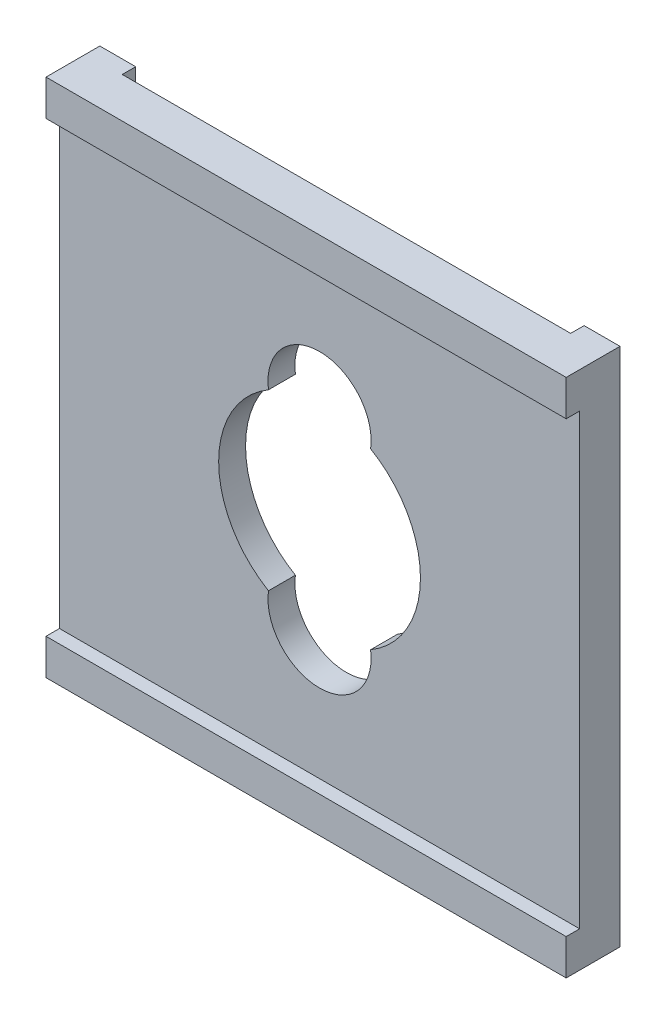
ISO-10303-21;
HEADER;
FILE_DESCRIPTION(('STEP AP214'),'2;1');
FILE_NAME('part.step','',(''),(''),'','','');
FILE_SCHEMA(('AUTOMOTIVE_DESIGN { 1 0 10303 214 1 1 1 1 }'));
ENDSEC;
DATA;
#1=APPLICATION_CONTEXT('core data for automotive mechanical design processes');
#2=APPLICATION_PROTOCOL_DEFINITION('international standard','automotive_design',2000,#1);
#3=PRODUCT_CONTEXT('',#1,'mechanical');
#4=PRODUCT('Part','Part','',(#3));
#5=PRODUCT_RELATED_PRODUCT_CATEGORY('part','',(#4));
#6=PRODUCT_DEFINITION_FORMATION('','',#4);
#7=PRODUCT_DEFINITION_CONTEXT('part definition',#1,'design');
#8=PRODUCT_DEFINITION('design','',#6,#7);
#9=PRODUCT_DEFINITION_SHAPE('','',#8);
#10=(LENGTH_UNIT() NAMED_UNIT(*) SI_UNIT(.MILLI.,.METRE.));
#11=(NAMED_UNIT(*) PLANE_ANGLE_UNIT() SI_UNIT($,.RADIAN.));
#12=(NAMED_UNIT(*) SI_UNIT($,.STERADIAN.) SOLID_ANGLE_UNIT());
#13=UNCERTAINTY_MEASURE_WITH_UNIT(LENGTH_MEASURE(1.E-05),#10,'distance_accuracy_value','');
#14=(GEOMETRIC_REPRESENTATION_CONTEXT(3) GLOBAL_UNCERTAINTY_ASSIGNED_CONTEXT((#13)) GLOBAL_UNIT_ASSIGNED_CONTEXT((#10,
#11,#12)) REPRESENTATION_CONTEXT('',''));
#15=CARTESIAN_POINT('',(0.,0.,0.));
#16=DIRECTION('',(0.,0.,1.));
#17=DIRECTION('',(1.,0.,0.));
#18=AXIS2_PLACEMENT_3D('',#15,#16,#17);
#19=CARTESIAN_POINT('',(-0.0195470704777411,0.0021960930231779,10.8922710575984));
#20=DIRECTION('',(0.,0.,-1.));
#21=DIRECTION('',(0.,-1.,0.));
#22=AXIS2_PLACEMENT_3D('',#19,#20,#21);
#23=PLANE('',#22);
#24=DIRECTION('',(0.,-1.,0.));
#25=VECTOR('',#24,1.);
#26=CARTESIAN_POINT('',(28.9804529295222,25.0021960930232,10.8922710575984));
#27=LINE('',#26,#25);
#28=CARTESIAN_POINT('',(28.9804529295222,25.0021960930232,10.8922710575984));
#29=VERTEX_POINT('',#28);
#30=CARTESIAN_POINT('',(28.9804529295222,-24.9978039069768,10.8922710575984));
#31=VERTEX_POINT('',#30);
#32=EDGE_CURVE('E35',#29,#31,#27,.T.);
#33=ORIENTED_EDGE('',*,*,#32,.F.);
#34=DIRECTION('',(-1.,0.,0.));
#35=VECTOR('',#34,1.);
#36=CARTESIAN_POINT('',(28.9804529295222,25.0021960930232,10.8922710575984));
#37=LINE('',#36,#35);
#38=CARTESIAN_POINT('',(-29.0195470704777,25.0021960930232,10.8922710575984));
#39=VERTEX_POINT('',#38);
#40=EDGE_CURVE('E11',#29,#39,#37,.T.);
#41=ORIENTED_EDGE('',*,*,#40,.T.);
#42=DIRECTION('',(0.,1.,0.));
#43=VECTOR('',#42,1.);
#44=CARTESIAN_POINT('',(-29.0195470704778,-24.9978039069768,10.8922710575984));
#45=LINE('',#44,#43);
#46=CARTESIAN_POINT('',(-29.0195470704778,-24.9978039069768,10.8922710575984));
#47=VERTEX_POINT('',#46);
#48=EDGE_CURVE('E149',#47,#39,#45,.T.);
#49=ORIENTED_EDGE('',*,*,#48,.F.);
#50=DIRECTION('',(-1.,0.,0.));
#51=VECTOR('',#50,1.);
#52=CARTESIAN_POINT('',(28.9804529295222,-24.9978039069768,10.8922710575984));
#53=LINE('',#52,#51);
#54=EDGE_CURVE('E173',#31,#47,#53,.T.);
#55=ORIENTED_EDGE('',*,*,#54,.F.);
#56=EDGE_LOOP('',(#33,#41,#49,#55));
#57=FACE_BOUND('',#56,.T.);
#58=CARTESIAN_POINT('',(-0.0195470704777371,10.5021960930232,10.8922710575984));
#59=DIRECTION('',(0.,0.,1.));
#60=DIRECTION('',(0.990332152637792,-0.138716356107699,0.));
#61=AXIS2_PLACEMENT_3D('',#58,#59,#60);
#62=CIRCLE('',#61,5.75);
#63=CARTESIAN_POINT('',(5.67486280718927,9.70457704540417,10.8922710575984));
#64=VERTEX_POINT('',#63);
#65=CARTESIAN_POINT('',(-5.71395694814473,9.70457704540418,10.8922710575984));
#66=VERTEX_POINT('',#65);
#67=EDGE_CURVE('E240',#64,#66,#62,.T.);
#68=ORIENTED_EDGE('',*,*,#67,.F.);
#69=CARTESIAN_POINT('',(-0.0195470704777411,0.0021960930231779,10.8922710575984));
#70=DIRECTION('',(0.,0.,1.));
#71=DIRECTION('',(0.506169766903774,-0.862433862433856,0.));
#72=AXIS2_PLACEMENT_3D('',#69,#70,#71);
#73=CIRCLE('',#72,11.25);
#74=CARTESIAN_POINT('',(5.67486280718926,-9.70018485935782,10.8922710575984));
#75=VERTEX_POINT('',#74);
#76=EDGE_CURVE('E234',#75,#64,#73,.T.);
#77=ORIENTED_EDGE('',*,*,#76,.F.);
#78=CARTESIAN_POINT('',(-0.0195470704777451,-10.4978039069768,10.8922710575984));
#79=DIRECTION('',(0.,0.,1.));
#80=DIRECTION('',(-0.990332152637792,0.138716356107699,0.));
#81=AXIS2_PLACEMENT_3D('',#78,#79,#80);
#82=CIRCLE('',#81,5.75);
#83=CARTESIAN_POINT('',(-5.71395694814475,-9.70018485935781,10.8922710575984));
#84=VERTEX_POINT('',#83);
#85=EDGE_CURVE('E216',#84,#75,#82,.T.);
#86=ORIENTED_EDGE('',*,*,#85,.F.);
#87=CARTESIAN_POINT('',(-0.0195470704777411,0.0021960930231779,10.8922710575984));
#88=DIRECTION('',(0.,0.,1.));
#89=DIRECTION('',(-0.506169766903774,0.862433862433856,0.));
#90=AXIS2_PLACEMENT_3D('',#87,#88,#89);
#91=CIRCLE('',#90,11.25);
#92=EDGE_CURVE('E243',#66,#84,#91,.T.);
#93=ORIENTED_EDGE('',*,*,#92,.F.);
#94=EDGE_LOOP('',(#68,#77,#86,#93));
#95=FACE_BOUND('',#94,.T.);
#96=ADVANCED_FACE('F17',(#57,#95),#23,.F.);
#97=CARTESIAN_POINT('',(-0.0195470704777411,0.0021960930231779,10.8922710575984));
#98=DIRECTION('',(0.,0.,-1.));
#99=DIRECTION('',(0.,-1.,0.));
#100=AXIS2_PLACEMENT_3D('',#97,#98,#99);
#101=CYLINDRICAL_SURFACE('',#100,11.25);
#102=DIRECTION('',(0.,0.,-1.));
#103=VECTOR('',#102,1.);
#104=CARTESIAN_POINT('',(-5.71395694814475,-9.70018485935781,10.8922710575984));
#105=LINE('',#104,#103);
#106=CARTESIAN_POINT('',(-5.71395694814475,-9.70018485935781,7.89227105759841));
#107=VERTEX_POINT('',#106);
#108=EDGE_CURVE('E27',#84,#107,#105,.T.);
#109=ORIENTED_EDGE('',*,*,#108,.T.);
#110=CARTESIAN_POINT('',(-0.0195470704777411,0.0021960930231779,7.89227105759841));
#111=DIRECTION('',(0.,0.,1.));
#112=DIRECTION('',(-0.506169766903774,0.862433862433856,0.));
#113=AXIS2_PLACEMENT_3D('',#110,#111,#112);
#114=CIRCLE('',#113,11.25);
#115=CARTESIAN_POINT('',(-5.71395694814473,9.70457704540418,7.89227105759841));
#116=VERTEX_POINT('',#115);
#117=EDGE_CURVE('E208',#116,#107,#114,.T.);
#118=ORIENTED_EDGE('',*,*,#117,.F.);
#119=DIRECTION('',(0.,0.,-1.));
#120=VECTOR('',#119,1.);
#121=CARTESIAN_POINT('',(-5.71395694814473,9.70457704540418,10.8922710575984));
#122=LINE('',#121,#120);
#123=EDGE_CURVE('E245',#66,#116,#122,.T.);
#124=ORIENTED_EDGE('',*,*,#123,.F.);
#125=ORIENTED_EDGE('',*,*,#92,.T.);
#126=EDGE_LOOP('',(#109,#118,#124,#125));
#127=FACE_BOUND('',#126,.T.);
#128=ADVANCED_FACE('F303',(#127),#101,.F.);
#129=CARTESIAN_POINT('',(-0.0195470704777371,10.5021960930232,10.8922710575984));
#130=DIRECTION('',(0.,0.,-1.));
#131=DIRECTION('',(0.,-1.,0.));
#132=AXIS2_PLACEMENT_3D('',#129,#130,#131);
#133=CYLINDRICAL_SURFACE('',#132,5.75);
#134=ORIENTED_EDGE('',*,*,#123,.T.);
#135=CARTESIAN_POINT('',(-0.0195470704777371,10.5021960930232,7.89227105759841));
#136=DIRECTION('',(0.,0.,1.));
#137=DIRECTION('',(0.990332152637792,-0.138716356107699,0.));
#138=AXIS2_PLACEMENT_3D('',#135,#136,#137);
#139=CIRCLE('',#138,5.75);
#140=CARTESIAN_POINT('',(5.67486280718927,9.70457704540417,7.89227105759841));
#141=VERTEX_POINT('',#140);
#142=EDGE_CURVE('E230',#141,#116,#139,.T.);
#143=ORIENTED_EDGE('',*,*,#142,.F.);
#144=DIRECTION('',(0.,0.,-1.));
#145=VECTOR('',#144,1.);
#146=CARTESIAN_POINT('',(5.67486280718927,9.70457704540417,10.8922710575984));
#147=LINE('',#146,#145);
#148=EDGE_CURVE('E237',#64,#141,#147,.T.);
#149=ORIENTED_EDGE('',*,*,#148,.F.);
#150=ORIENTED_EDGE('',*,*,#67,.T.);
#151=EDGE_LOOP('',(#134,#143,#149,#150));
#152=FACE_BOUND('',#151,.T.);
#153=ADVANCED_FACE('F308',(#152),#133,.F.);
#154=CARTESIAN_POINT('',(-0.0195470704777411,0.0021960930231779,10.8922710575984));
#155=DIRECTION('',(0.,0.,-1.));
#156=DIRECTION('',(0.,-1.,0.));
#157=AXIS2_PLACEMENT_3D('',#154,#155,#156);
#158=CYLINDRICAL_SURFACE('',#157,11.25);
#159=ORIENTED_EDGE('',*,*,#148,.T.);
#160=CARTESIAN_POINT('',(-0.0195470704777411,0.0021960930231779,7.89227105759841));
#161=DIRECTION('',(0.,0.,1.));
#162=DIRECTION('',(0.506169766903774,-0.862433862433856,0.));
#163=AXIS2_PLACEMENT_3D('',#160,#161,#162);
#164=CIRCLE('',#163,11.25);
#165=CARTESIAN_POINT('',(5.67486280718926,-9.70018485935782,7.89227105759841));
#166=VERTEX_POINT('',#165);
#167=EDGE_CURVE('E227',#166,#141,#164,.T.);
#168=ORIENTED_EDGE('',*,*,#167,.F.);
#169=DIRECTION('',(0.,0.,-1.));
#170=VECTOR('',#169,1.);
#171=CARTESIAN_POINT('',(5.67486280718926,-9.70018485935782,10.8922710575984));
#172=LINE('',#171,#170);
#173=EDGE_CURVE('E231',#75,#166,#172,.T.);
#174=ORIENTED_EDGE('',*,*,#173,.F.);
#175=ORIENTED_EDGE('',*,*,#76,.T.);
#176=EDGE_LOOP('',(#159,#168,#174,#175));
#177=FACE_BOUND('',#176,.T.);
#178=ADVANCED_FACE('F314',(#177),#158,.F.);
#179=CARTESIAN_POINT('',(-0.0195470704777451,-10.4978039069768,10.8922710575984));
#180=DIRECTION('',(0.,0.,-1.));
#181=DIRECTION('',(0.,-1.,0.));
#182=AXIS2_PLACEMENT_3D('',#179,#180,#181);
#183=CYLINDRICAL_SURFACE('',#182,5.75);
#184=ORIENTED_EDGE('',*,*,#173,.T.);
#185=CARTESIAN_POINT('',(-0.0195470704777451,-10.4978039069768,7.89227105759841));
#186=DIRECTION('',(0.,0.,1.));
#187=DIRECTION('',(-0.990332152637792,0.138716356107699,0.));
#188=AXIS2_PLACEMENT_3D('',#185,#186,#187);
#189=CIRCLE('',#188,5.75);
#190=EDGE_CURVE('E223',#107,#166,#189,.T.);
#191=ORIENTED_EDGE('',*,*,#190,.F.);
#192=ORIENTED_EDGE('',*,*,#108,.F.);
#193=ORIENTED_EDGE('',*,*,#85,.T.);
#194=EDGE_LOOP('',(#184,#191,#192,#193));
#195=FACE_BOUND('',#194,.T.);
#196=ADVANCED_FACE('F318',(#195),#183,.F.);
#197=CARTESIAN_POINT('',(-0.0195470704777411,0.0021960930231779,7.89227105759841));
#198=DIRECTION('',(0.,0.,-1.));
#199=DIRECTION('',(0.,-1.,0.));
#200=AXIS2_PLACEMENT_3D('',#197,#198,#199);
#201=PLANE('',#200);
#202=DIRECTION('',(1.,0.,0.));
#203=VECTOR('',#202,1.);
#204=CARTESIAN_POINT('',(-25.0195470704777,29.0021960930232,7.89227105759841));
#205=LINE('',#204,#203);
#206=CARTESIAN_POINT('',(-25.0195470704777,29.0021960930232,7.89227105759841));
#207=VERTEX_POINT('',#206);
#208=CARTESIAN_POINT('',(24.9804529295222,29.0021960930232,7.89227105759841));
#209=VERTEX_POINT('',#208);
#210=EDGE_CURVE('E213',#207,#209,#205,.T.);
#211=ORIENTED_EDGE('',*,*,#210,.T.);
#212=DIRECTION('',(0.,-1.,0.));
#213=VECTOR('',#212,1.);
#214=CARTESIAN_POINT('',(24.9804529295222,29.0021960930232,7.89227105759841));
#215=LINE('',#214,#213);
#216=CARTESIAN_POINT('',(24.9804529295222,-28.9978039069768,7.89227105759841));
#217=VERTEX_POINT('',#216);
#218=EDGE_CURVE('E217',#209,#217,#215,.T.);
#219=ORIENTED_EDGE('',*,*,#218,.T.);
#220=DIRECTION('',(-1.,0.,0.));
#221=VECTOR('',#220,1.);
#222=CARTESIAN_POINT('',(24.9804529295222,-28.9978039069768,7.89227105759841));
#223=LINE('',#222,#221);
#224=CARTESIAN_POINT('',(-25.0195470704777,-28.9978039069767,7.89227105759841));
#225=VERTEX_POINT('',#224);
#226=EDGE_CURVE('E220',#217,#225,#223,.T.);
#227=ORIENTED_EDGE('',*,*,#226,.T.);
#228=DIRECTION('',(0.,-1.,0.));
#229=VECTOR('',#228,1.);
#230=CARTESIAN_POINT('',(-25.0195470704777,29.0021960930232,7.89227105759841));
#231=LINE('',#230,#229);
#232=EDGE_CURVE('E209',#207,#225,#231,.T.);
#233=ORIENTED_EDGE('',*,*,#232,.F.);
#234=EDGE_LOOP('',(#211,#219,#227,#233));
#235=FACE_BOUND('',#234,.T.);
#236=ORIENTED_EDGE('',*,*,#190,.T.);
#237=ORIENTED_EDGE('',*,*,#167,.T.);
#238=ORIENTED_EDGE('',*,*,#142,.T.);
#239=ORIENTED_EDGE('',*,*,#117,.T.);
#240=EDGE_LOOP('',(#236,#237,#238,#239));
#241=FACE_BOUND('',#240,.T.);
#242=ADVANCED_FACE('F286',(#235,#241),#201,.T.);
#243=CARTESIAN_POINT('',(-25.0195470704777,29.0021960930232,7.89227105759841));
#244=DIRECTION('',(1.,0.,0.));
#245=DIRECTION('',(0.,-1.,0.));
#246=AXIS2_PLACEMENT_3D('',#243,#244,#245);
#247=PLANE('',#246);
#248=DIRECTION('',(0.,0.,-1.));
#249=VECTOR('',#248,1.);
#250=CARTESIAN_POINT('',(-25.0195470704777,-28.9978039069767,7.89227105759841));
#251=LINE('',#250,#249);
#252=CARTESIAN_POINT('',(-25.0195470704777,-28.9978039069767,6.3922710575984));
#253=VERTEX_POINT('',#252);
#254=EDGE_CURVE('E207',#225,#253,#251,.T.);
#255=ORIENTED_EDGE('',*,*,#254,.T.);
#256=DIRECTION('',(0.,-1.,0.));
#257=VECTOR('',#256,1.);
#258=CARTESIAN_POINT('',(-25.0195470704777,29.0021960930232,6.3922710575984));
#259=LINE('',#258,#257);
#260=CARTESIAN_POINT('',(-25.0195470704777,29.0021960930232,6.3922710575984));
#261=VERTEX_POINT('',#260);
#262=EDGE_CURVE('E152',#261,#253,#259,.T.);
#263=ORIENTED_EDGE('',*,*,#262,.F.);
#264=DIRECTION('',(0.,0.,-1.));
#265=VECTOR('',#264,1.);
#266=CARTESIAN_POINT('',(-25.0195470704777,29.0021960930232,7.89227105759841));
#267=LINE('',#266,#265);
#268=EDGE_CURVE('E187',#207,#261,#267,.T.);
#269=ORIENTED_EDGE('',*,*,#268,.F.);
#270=ORIENTED_EDGE('',*,*,#232,.T.);
#271=EDGE_LOOP('',(#255,#263,#269,#270));
#272=FACE_BOUND('',#271,.T.);
#273=ADVANCED_FACE('F281',(#272),#247,.T.);
#274=CARTESIAN_POINT('',(-29.0195470704777,29.0021960930232,10.8922710575984));
#275=DIRECTION('',(0.,1.,0.));
#276=DIRECTION('',(1.,0.,0.));
#277=AXIS2_PLACEMENT_3D('',#274,#275,#276);
#278=PLANE('',#277);
#279=DIRECTION('',(1.,0.,0.));
#280=VECTOR('',#279,1.);
#281=CARTESIAN_POINT('',(24.9804529295222,29.0021960930232,6.3922710575984));
#282=LINE('',#281,#280);
#283=CARTESIAN_POINT('',(24.9804529295222,29.0021960930232,6.3922710575984));
#284=VERTEX_POINT('',#283);
#285=CARTESIAN_POINT('',(28.9804529295222,29.0021960930232,6.3922710575984));
#286=VERTEX_POINT('',#285);
#287=EDGE_CURVE('E195',#284,#286,#282,.T.);
#288=ORIENTED_EDGE('',*,*,#287,.F.);
#289=DIRECTION('',(0.,0.,-1.));
#290=VECTOR('',#289,1.);
#291=CARTESIAN_POINT('',(24.9804529295222,29.0021960930232,7.89227105759841));
#292=LINE('',#291,#290);
#293=EDGE_CURVE('E172',#209,#284,#292,.T.);
#294=ORIENTED_EDGE('',*,*,#293,.F.);
#295=ORIENTED_EDGE('',*,*,#210,.F.);
#296=ORIENTED_EDGE('',*,*,#268,.T.);
#297=DIRECTION('',(1.,0.,0.));
#298=VECTOR('',#297,1.);
#299=CARTESIAN_POINT('',(-29.0195470704777,29.0021960930232,6.3922710575984));
#300=LINE('',#299,#298);
#301=CARTESIAN_POINT('',(-29.0195470704777,29.0021960930232,6.3922710575984));
#302=VERTEX_POINT('',#301);
#303=EDGE_CURVE('E154',#302,#261,#300,.T.);
#304=ORIENTED_EDGE('',*,*,#303,.F.);
#305=DIRECTION('',(0.,0.,-1.));
#306=VECTOR('',#305,1.);
#307=CARTESIAN_POINT('',(-29.0195470704777,29.0021960930232,12.3922710575984));
#308=LINE('',#307,#306);
#309=CARTESIAN_POINT('',(-29.0195470704777,29.0021960930232,12.3922710575984));
#310=VERTEX_POINT('',#309);
#311=EDGE_CURVE('E134',#310,#302,#308,.T.);
#312=ORIENTED_EDGE('',*,*,#311,.F.);
#313=DIRECTION('',(-1.,0.,0.));
#314=VECTOR('',#313,1.);
#315=CARTESIAN_POINT('',(28.9804529295222,29.0021960930232,12.3922710575984));
#316=LINE('',#315,#314);
#317=CARTESIAN_POINT('',(28.9804529295222,29.0021960930232,12.3922710575984));
#318=VERTEX_POINT('',#317);
#319=EDGE_CURVE('E176',#318,#310,#316,.T.);
#320=ORIENTED_EDGE('',*,*,#319,.F.);
#321=DIRECTION('',(0.,0.,1.));
#322=VECTOR('',#321,1.);
#323=CARTESIAN_POINT('',(28.9804529295222,29.0021960930232,6.3922710575984));
#324=LINE('',#323,#322);
#325=EDGE_CURVE('E192',#286,#318,#324,.T.);
#326=ORIENTED_EDGE('',*,*,#325,.F.);
#327=EDGE_LOOP('',(#288,#294,#295,#296,#304,#312,#320,#326));
#328=FACE_BOUND('',#327,.T.);
#329=ADVANCED_FACE('F276',(#328),#278,.T.);
#330=CARTESIAN_POINT('',(28.9804529295222,29.0021960930232,10.8922710575984));
#331=DIRECTION('',(1.,0.,0.));
#332=DIRECTION('',(0.,-1.,0.));
#333=AXIS2_PLACEMENT_3D('',#330,#331,#332);
#334=PLANE('',#333);
#335=DIRECTION('',(0.,0.,1.));
#336=VECTOR('',#335,1.);
#337=CARTESIAN_POINT('',(28.9804529295222,-24.9978039069768,10.8922710575984));
#338=LINE('',#337,#336);
#339=CARTESIAN_POINT('',(28.9804529295222,-24.9978039069768,12.3922710575984));
#340=VERTEX_POINT('',#339);
#341=EDGE_CURVE('E184',#31,#340,#338,.T.);
#342=ORIENTED_EDGE('',*,*,#341,.T.);
#343=DIRECTION('',(0.,1.,0.));
#344=VECTOR('',#343,1.);
#345=CARTESIAN_POINT('',(28.9804529295222,-28.9978039069769,12.3922710575984));
#346=LINE('',#345,#344);
#347=CARTESIAN_POINT('',(28.9804529295222,-28.9978039069769,12.3922710575984));
#348=VERTEX_POINT('',#347);
#349=EDGE_CURVE('E167',#348,#340,#346,.T.);
#350=ORIENTED_EDGE('',*,*,#349,.F.);
#351=DIRECTION('',(0.,0.,-1.));
#352=VECTOR('',#351,1.);
#353=CARTESIAN_POINT('',(28.9804529295222,-28.9978039069769,12.3922710575984));
#354=LINE('',#353,#352);
#355=CARTESIAN_POINT('',(28.9804529295222,-28.9978039069769,6.3922710575984));
#356=VERTEX_POINT('',#355);
#357=EDGE_CURVE('E188',#348,#356,#354,.T.);
#358=ORIENTED_EDGE('',*,*,#357,.T.);
#359=DIRECTION('',(0.,-1.,0.));
#360=VECTOR('',#359,1.);
#361=CARTESIAN_POINT('',(28.9804529295222,29.0021960930232,6.3922710575984));
#362=LINE('',#361,#360);
#363=EDGE_CURVE('E193',#286,#356,#362,.T.);
#364=ORIENTED_EDGE('',*,*,#363,.F.);
#365=ORIENTED_EDGE('',*,*,#325,.T.);
#366=DIRECTION('',(0.,1.,0.));
#367=VECTOR('',#366,1.);
#368=CARTESIAN_POINT('',(28.9804529295222,25.0021960930232,12.3922710575984));
#369=LINE('',#368,#367);
#370=CARTESIAN_POINT('',(28.9804529295222,25.0021960930232,12.3922710575984));
#371=VERTEX_POINT('',#370);
#372=EDGE_CURVE('E180',#371,#318,#369,.T.);
#373=ORIENTED_EDGE('',*,*,#372,.F.);
#374=DIRECTION('',(0.,0.,1.));
#375=VECTOR('',#374,1.);
#376=CARTESIAN_POINT('',(28.9804529295222,25.0021960930232,10.8922710575984));
#377=LINE('',#376,#375);
#378=EDGE_CURVE('E148',#29,#371,#377,.T.);
#379=ORIENTED_EDGE('',*,*,#378,.F.);
#380=ORIENTED_EDGE('',*,*,#32,.T.);
#381=EDGE_LOOP('',(#342,#350,#358,#364,#365,#373,#379,#380));
#382=FACE_BOUND('',#381,.T.);
#383=ADVANCED_FACE('F266',(#382),#334,.T.);
#384=CARTESIAN_POINT('',(-29.0195470704777,25.0021960930232,10.8922710575984));
#385=DIRECTION('',(0.,-1.,0.));
#386=DIRECTION('',(1.,0.,0.));
#387=AXIS2_PLACEMENT_3D('',#384,#385,#386);
#388=PLANE('',#387);
#389=ORIENTED_EDGE('',*,*,#378,.T.);
#390=DIRECTION('',(1.,0.,0.));
#391=VECTOR('',#390,1.);
#392=CARTESIAN_POINT('',(-29.0195470704777,25.0021960930232,12.3922710575984));
#393=LINE('',#392,#391);
#394=CARTESIAN_POINT('',(-29.0195470704777,25.0021960930232,12.3922710575984));
#395=VERTEX_POINT('',#394);
#396=EDGE_CURVE('E177',#395,#371,#393,.T.);
#397=ORIENTED_EDGE('',*,*,#396,.F.);
#398=DIRECTION('',(0.,0.,1.));
#399=VECTOR('',#398,1.);
#400=CARTESIAN_POINT('',(-29.0195470704777,25.0021960930232,10.8922710575984));
#401=LINE('',#400,#399);
#402=EDGE_CURVE('E181',#39,#395,#401,.T.);
#403=ORIENTED_EDGE('',*,*,#402,.F.);
#404=ORIENTED_EDGE('',*,*,#40,.F.);
#405=EDGE_LOOP('',(#389,#397,#403,#404));
#406=FACE_BOUND('',#405,.T.);
#407=ADVANCED_FACE('F270',(#406),#388,.T.);
#408=CARTESIAN_POINT('',(-29.0195470704777,-28.9978039069768,10.8922710575984));
#409=DIRECTION('',(-1.,0.,0.));
#410=DIRECTION('',(0.,1.,0.));
#411=AXIS2_PLACEMENT_3D('',#408,#409,#410);
#412=PLANE('',#411);
#413=DIRECTION('',(0.,1.,0.));
#414=VECTOR('',#413,1.);
#415=CARTESIAN_POINT('',(-29.0195470704777,-28.9978039069768,6.3922710575984));
#416=LINE('',#415,#414);
#417=CARTESIAN_POINT('',(-29.0195470704777,-28.9978039069768,6.3922710575984));
#418=VERTEX_POINT('',#417);
#419=EDGE_CURVE('E126',#418,#302,#416,.T.);
#420=ORIENTED_EDGE('',*,*,#419,.F.);
#421=DIRECTION('',(0.,0.,1.));
#422=VECTOR('',#421,1.);
#423=CARTESIAN_POINT('',(-29.0195470704777,-28.9978039069768,6.3922710575984));
#424=LINE('',#423,#422);
#425=CARTESIAN_POINT('',(-29.0195470704777,-28.9978039069768,12.3922710575984));
#426=VERTEX_POINT('',#425);
#427=EDGE_CURVE('E130',#418,#426,#424,.T.);
#428=ORIENTED_EDGE('',*,*,#427,.T.);
#429=DIRECTION('',(0.,-1.,0.));
#430=VECTOR('',#429,1.);
#431=CARTESIAN_POINT('',(-29.0195470704778,-24.9978039069768,12.3922710575984));
#432=LINE('',#431,#430);
#433=CARTESIAN_POINT('',(-29.0195470704778,-24.9978039069768,12.3922710575984));
#434=VERTEX_POINT('',#433);
#435=EDGE_CURVE('E166',#434,#426,#432,.T.);
#436=ORIENTED_EDGE('',*,*,#435,.F.);
#437=DIRECTION('',(0.,0.,1.));
#438=VECTOR('',#437,1.);
#439=CARTESIAN_POINT('',(-29.0195470704778,-24.9978039069768,10.8922710575984));
#440=LINE('',#439,#438);
#441=EDGE_CURVE('E170',#47,#434,#440,.T.);
#442=ORIENTED_EDGE('',*,*,#441,.F.);
#443=ORIENTED_EDGE('',*,*,#48,.T.);
#444=ORIENTED_EDGE('',*,*,#402,.T.);
#445=DIRECTION('',(0.,-1.,0.));
#446=VECTOR('',#445,1.);
#447=CARTESIAN_POINT('',(-29.0195470704777,29.0021960930232,12.3922710575984));
#448=LINE('',#447,#446);
#449=EDGE_CURVE('E160',#310,#395,#448,.T.);
#450=ORIENTED_EDGE('',*,*,#449,.F.);
#451=ORIENTED_EDGE('',*,*,#311,.T.);
#452=EDGE_LOOP('',(#420,#428,#436,#442,#443,#444,#450,#451));
#453=FACE_BOUND('',#452,.T.);
#454=ADVANCED_FACE('F128',(#453),#412,.T.);
#455=CARTESIAN_POINT('',(-0.0195470704777411,0.0021960930231779,12.3922710575984));
#456=DIRECTION('',(0.,0.,1.));
#457=DIRECTION('',(-1.,0.,0.));
#458=AXIS2_PLACEMENT_3D('',#455,#456,#457);
#459=PLANE('',#458);
#460=DIRECTION('',(-1.,0.,0.));
#461=VECTOR('',#460,1.);
#462=CARTESIAN_POINT('',(28.9804529295222,-24.9978039069768,12.3922710575984));
#463=LINE('',#462,#461);
#464=EDGE_CURVE('E163',#340,#434,#463,.T.);
#465=ORIENTED_EDGE('',*,*,#464,.T.);
#466=ORIENTED_EDGE('',*,*,#435,.T.);
#467=DIRECTION('',(1.,0.,0.));
#468=VECTOR('',#467,1.);
#469=CARTESIAN_POINT('',(-29.0195470704777,-28.9978039069768,12.3922710575984));
#470=LINE('',#469,#468);
#471=EDGE_CURVE('E147',#426,#348,#470,.T.);
#472=ORIENTED_EDGE('',*,*,#471,.T.);
#473=ORIENTED_EDGE('',*,*,#349,.T.);
#474=EDGE_LOOP('',(#465,#466,#472,#473));
#475=FACE_BOUND('',#474,.T.);
#476=ADVANCED_FACE('F264',(#475),#459,.T.);
#477=CARTESIAN_POINT('',(-0.0195470704777411,0.0021960930231779,12.3922710575984));
#478=DIRECTION('',(0.,0.,1.));
#479=DIRECTION('',(-1.,0.,0.));
#480=AXIS2_PLACEMENT_3D('',#477,#478,#479);
#481=PLANE('',#480);
#482=ORIENTED_EDGE('',*,*,#396,.T.);
#483=ORIENTED_EDGE('',*,*,#372,.T.);
#484=ORIENTED_EDGE('',*,*,#319,.T.);
#485=ORIENTED_EDGE('',*,*,#449,.T.);
#486=EDGE_LOOP('',(#482,#483,#484,#485));
#487=FACE_BOUND('',#486,.T.);
#488=ADVANCED_FACE('F272',(#487),#481,.T.);
#489=CARTESIAN_POINT('',(28.9804529295222,-28.9978039069769,10.8922710575984));
#490=DIRECTION('',(0.,-1.,0.));
#491=DIRECTION('',(-1.,0.,0.));
#492=AXIS2_PLACEMENT_3D('',#489,#490,#491);
#493=PLANE('',#492);
#494=DIRECTION('',(-1.,0.,0.));
#495=VECTOR('',#494,1.);
#496=CARTESIAN_POINT('',(-25.0195470704777,-28.9978039069767,6.3922710575984));
#497=LINE('',#496,#495);
#498=EDGE_CURVE('E138',#253,#418,#497,.T.);
#499=ORIENTED_EDGE('',*,*,#498,.F.);
#500=ORIENTED_EDGE('',*,*,#254,.F.);
#501=ORIENTED_EDGE('',*,*,#226,.F.);
#502=DIRECTION('',(0.,0.,-1.));
#503=VECTOR('',#502,1.);
#504=CARTESIAN_POINT('',(24.9804529295222,-28.9978039069768,7.89227105759841));
#505=LINE('',#504,#503);
#506=CARTESIAN_POINT('',(24.9804529295222,-28.9978039069768,6.3922710575984));
#507=VERTEX_POINT('',#506);
#508=EDGE_CURVE('E157',#217,#507,#505,.T.);
#509=ORIENTED_EDGE('',*,*,#508,.T.);
#510=DIRECTION('',(-1.,0.,0.));
#511=VECTOR('',#510,1.);
#512=CARTESIAN_POINT('',(28.9804529295222,-28.9978039069769,6.3922710575984));
#513=LINE('',#512,#511);
#514=EDGE_CURVE('E139',#356,#507,#513,.T.);
#515=ORIENTED_EDGE('',*,*,#514,.F.);
#516=ORIENTED_EDGE('',*,*,#357,.F.);
#517=ORIENTED_EDGE('',*,*,#471,.F.);
#518=ORIENTED_EDGE('',*,*,#427,.F.);
#519=EDGE_LOOP('',(#499,#500,#501,#509,#515,#516,#517,#518));
#520=FACE_BOUND('',#519,.T.);
#521=ADVANCED_FACE('F143',(#520),#493,.T.);
#522=CARTESIAN_POINT('',(-0.0195470704777411,0.0021960930231779,6.3922710575984));
#523=DIRECTION('',(0.,0.,-1.));
#524=DIRECTION('',(0.,-1.,0.));
#525=AXIS2_PLACEMENT_3D('',#522,#523,#524);
#526=PLANE('',#525);
#527=ORIENTED_EDGE('',*,*,#303,.T.);
#528=ORIENTED_EDGE('',*,*,#262,.T.);
#529=ORIENTED_EDGE('',*,*,#498,.T.);
#530=ORIENTED_EDGE('',*,*,#419,.T.);
#531=EDGE_LOOP('',(#527,#528,#529,#530));
#532=FACE_BOUND('',#531,.T.);
#533=ADVANCED_FACE('F151',(#532),#526,.T.);
#534=CARTESIAN_POINT('',(-0.0195470704777411,0.0021960930231779,6.3922710575984));
#535=DIRECTION('',(0.,0.,-1.));
#536=DIRECTION('',(0.,-1.,0.));
#537=AXIS2_PLACEMENT_3D('',#534,#535,#536);
#538=PLANE('',#537);
#539=ORIENTED_EDGE('',*,*,#514,.T.);
#540=DIRECTION('',(0.,1.,0.));
#541=VECTOR('',#540,1.);
#542=CARTESIAN_POINT('',(24.9804529295222,-28.9978039069768,6.3922710575984));
#543=LINE('',#542,#541);
#544=EDGE_CURVE('E21',#507,#284,#543,.T.);
#545=ORIENTED_EDGE('',*,*,#544,.T.);
#546=ORIENTED_EDGE('',*,*,#287,.T.);
#547=ORIENTED_EDGE('',*,*,#363,.T.);
#548=EDGE_LOOP('',(#539,#545,#546,#547));
#549=FACE_BOUND('',#548,.T.);
#550=ADVANCED_FACE('F292',(#549),#538,.T.);
#551=CARTESIAN_POINT('',(24.9804529295222,-28.9978039069768,7.89227105759841));
#552=DIRECTION('',(-1.,0.,0.));
#553=DIRECTION('',(0.,1.,0.));
#554=AXIS2_PLACEMENT_3D('',#551,#552,#553);
#555=PLANE('',#554);
#556=ORIENTED_EDGE('',*,*,#293,.T.);
#557=ORIENTED_EDGE('',*,*,#544,.F.);
#558=ORIENTED_EDGE('',*,*,#508,.F.);
#559=ORIENTED_EDGE('',*,*,#218,.F.);
#560=EDGE_LOOP('',(#556,#557,#558,#559));
#561=FACE_BOUND('',#560,.T.);
#562=ADVANCED_FACE('F289',(#561),#555,.T.);
#563=CARTESIAN_POINT('',(28.9804529295222,-24.9978039069768,10.8922710575984));
#564=DIRECTION('',(0.,1.,0.));
#565=DIRECTION('',(-1.,0.,0.));
#566=AXIS2_PLACEMENT_3D('',#563,#564,#565);
#567=PLANE('',#566);
#568=ORIENTED_EDGE('',*,*,#441,.T.);
#569=ORIENTED_EDGE('',*,*,#464,.F.);
#570=ORIENTED_EDGE('',*,*,#341,.F.);
#571=ORIENTED_EDGE('',*,*,#54,.T.);
#572=EDGE_LOOP('',(#568,#569,#570,#571));
#573=FACE_BOUND('',#572,.T.);
#574=ADVANCED_FACE('F19',(#573),#567,.T.);
#575=CLOSED_SHELL('',(#96,#128,#153,#178,#196,#242,#273,#329,#383,#407,#454,#476,#488,#521,#533,
#550,#562,#574));
#576=MANIFOLD_SOLID_BREP('B1',#575);
#577=ADVANCED_BREP_SHAPE_REPRESENTATION('',(#18,#576),#14);
#578=SHAPE_DEFINITION_REPRESENTATION(#9,#577);
ENDSEC;
END-ISO-10303-21;
